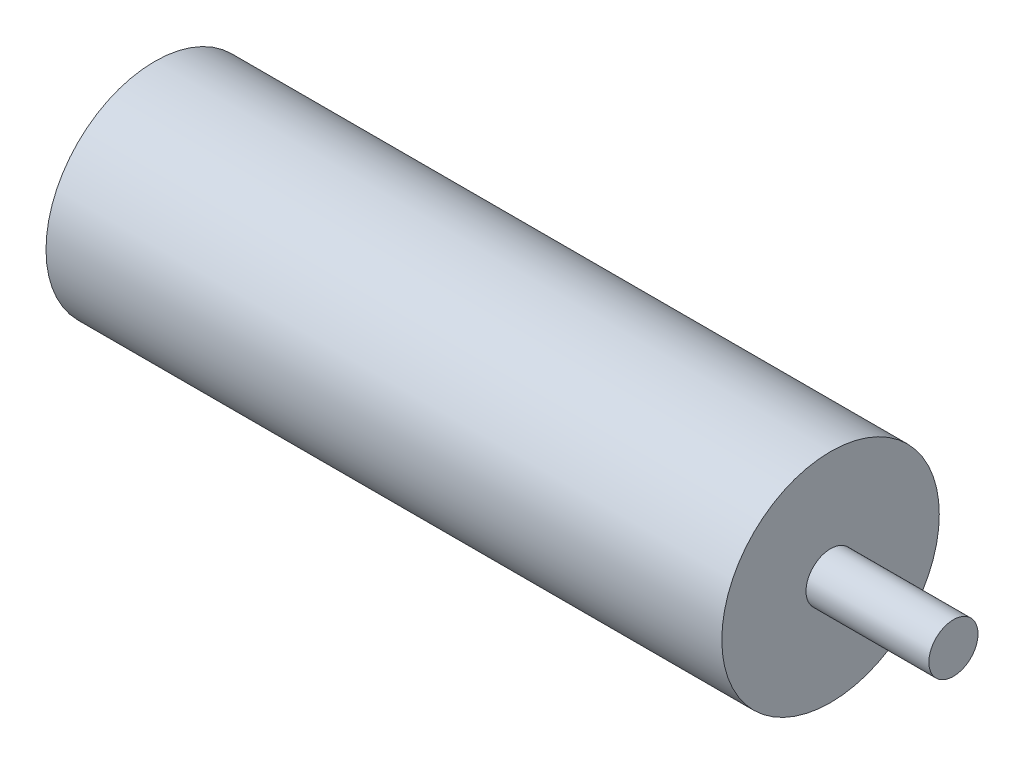
ISO-10303-21;
HEADER;
FILE_DESCRIPTION(('STEP AP214'),'2;1');
FILE_NAME('part.step','',(''),(''),'','','');
FILE_SCHEMA(('AUTOMOTIVE_DESIGN { 1 0 10303 214 1 1 1 1 }'));
ENDSEC;
DATA;
#1=APPLICATION_CONTEXT('core data for automotive mechanical design processes');
#2=APPLICATION_PROTOCOL_DEFINITION('international standard','automotive_design',2000,#1);
#3=PRODUCT_CONTEXT('',#1,'mechanical');
#4=PRODUCT('Part','Part','',(#3));
#5=PRODUCT_RELATED_PRODUCT_CATEGORY('part','',(#4));
#6=PRODUCT_DEFINITION_FORMATION('','',#4);
#7=PRODUCT_DEFINITION_CONTEXT('part definition',#1,'design');
#8=PRODUCT_DEFINITION('design','',#6,#7);
#9=PRODUCT_DEFINITION_SHAPE('','',#8);
#10=(LENGTH_UNIT() NAMED_UNIT(*) SI_UNIT(.MILLI.,.METRE.));
#11=(NAMED_UNIT(*) PLANE_ANGLE_UNIT() SI_UNIT($,.RADIAN.));
#12=(NAMED_UNIT(*) SI_UNIT($,.STERADIAN.) SOLID_ANGLE_UNIT());
#13=UNCERTAINTY_MEASURE_WITH_UNIT(LENGTH_MEASURE(1.E-05),#10,'distance_accuracy_value','');
#14=(GEOMETRIC_REPRESENTATION_CONTEXT(3) GLOBAL_UNCERTAINTY_ASSIGNED_CONTEXT((#13)) GLOBAL_UNIT_ASSIGNED_CONTEXT((#10,
#11,#12)) REPRESENTATION_CONTEXT('',''));
#15=CARTESIAN_POINT('',(0.,0.,0.));
#16=DIRECTION('',(0.,0.,1.));
#17=DIRECTION('',(1.,0.,0.));
#18=AXIS2_PLACEMENT_3D('',#15,#16,#17);
#19=CARTESIAN_POINT('',(139.7,0.,0.));
#20=DIRECTION('',(-1.,0.,0.));
#21=DIRECTION('',(0.,0.,1.));
#22=AXIS2_PLACEMENT_3D('',#19,#20,#21);
#23=CYLINDRICAL_SURFACE('',#22,22.479);
#24=CARTESIAN_POINT('',(139.7,0.,0.));
#25=DIRECTION('',(1.,0.,0.));
#26=DIRECTION('',(0.,0.,-1.));
#27=AXIS2_PLACEMENT_3D('',#24,#25,#26);
#28=CIRCLE('',#27,22.479);
#29=CARTESIAN_POINT('',(139.7,0.,-22.479));
#30=VERTEX_POINT('',#29);
#31=EDGE_CURVE('E10',#30,#30,#28,.T.);
#32=ORIENTED_EDGE('',*,*,#31,.F.);
#33=EDGE_LOOP('',(#32));
#34=FACE_BOUND('',#33,.T.);
#35=CARTESIAN_POINT('',(0.,0.,0.));
#36=DIRECTION('',(1.,0.,0.));
#37=DIRECTION('',(0.,0.,-1.));
#38=AXIS2_PLACEMENT_3D('',#35,#36,#37);
#39=CIRCLE('',#38,22.479);
#40=CARTESIAN_POINT('',(0.,0.,-22.479));
#41=VERTEX_POINT('',#40);
#42=EDGE_CURVE('E34',#41,#41,#39,.T.);
#43=ORIENTED_EDGE('',*,*,#42,.T.);
#44=EDGE_LOOP('',(#43));
#45=FACE_BOUND('',#44,.T.);
#46=ADVANCED_FACE('F31',(#34,#45),#23,.T.);
#47=CARTESIAN_POINT('',(139.7,0.,0.));
#48=DIRECTION('',(1.,0.,0.));
#49=DIRECTION('',(0.,0.,-1.));
#50=AXIS2_PLACEMENT_3D('',#47,#48,#49);
#51=PLANE('',#50);
#52=CARTESIAN_POINT('',(139.7,0.,0.));
#53=DIRECTION('',(1.,0.,0.));
#54=DIRECTION('',(0.,0.,-1.));
#55=AXIS2_PLACEMENT_3D('',#52,#53,#54);
#56=CIRCLE('',#55,5.08);
#57=CARTESIAN_POINT('',(139.7,0.,-5.08));
#58=VERTEX_POINT('',#57);
#59=EDGE_CURVE('E43',#58,#58,#56,.T.);
#60=ORIENTED_EDGE('',*,*,#59,.F.);
#61=EDGE_LOOP('',(#60));
#62=FACE_BOUND('',#61,.T.);
#63=ORIENTED_EDGE('',*,*,#31,.T.);
#64=EDGE_LOOP('',(#63));
#65=FACE_BOUND('',#64,.T.);
#66=ADVANCED_FACE('F58',(#62,#65),#51,.T.);
#67=CARTESIAN_POINT('',(0.,0.,0.));
#68=DIRECTION('',(1.,0.,0.));
#69=DIRECTION('',(0.,0.,-1.));
#70=AXIS2_PLACEMENT_3D('',#67,#68,#69);
#71=PLANE('',#70);
#72=ORIENTED_EDGE('',*,*,#42,.F.);
#73=EDGE_LOOP('',(#72));
#74=FACE_BOUND('',#73,.T.);
#75=ADVANCED_FACE('F54',(#74),#71,.F.);
#76=CARTESIAN_POINT('',(165.1,0.,0.));
#77=DIRECTION('',(-1.,0.,0.));
#78=DIRECTION('',(0.,0.,1.));
#79=AXIS2_PLACEMENT_3D('',#76,#77,#78);
#80=CYLINDRICAL_SURFACE('',#79,5.08);
#81=CARTESIAN_POINT('',(165.1,0.,0.));
#82=DIRECTION('',(1.,0.,0.));
#83=DIRECTION('',(0.,0.,-1.));
#84=AXIS2_PLACEMENT_3D('',#81,#82,#83);
#85=CIRCLE('',#84,5.08);
#86=CARTESIAN_POINT('',(165.1,0.,-5.08));
#87=VERTEX_POINT('',#86);
#88=EDGE_CURVE('E41',#87,#87,#85,.T.);
#89=ORIENTED_EDGE('',*,*,#88,.F.);
#90=EDGE_LOOP('',(#89));
#91=FACE_BOUND('',#90,.T.);
#92=ORIENTED_EDGE('',*,*,#59,.T.);
#93=EDGE_LOOP('',(#92));
#94=FACE_BOUND('',#93,.T.);
#95=ADVANCED_FACE('F51',(#91,#94),#80,.T.);
#96=CARTESIAN_POINT('',(165.1,0.,0.));
#97=DIRECTION('',(1.,0.,0.));
#98=DIRECTION('',(0.,0.,-1.));
#99=AXIS2_PLACEMENT_3D('',#96,#97,#98);
#100=PLANE('',#99);
#101=ORIENTED_EDGE('',*,*,#88,.T.);
#102=EDGE_LOOP('',(#101));
#103=FACE_BOUND('',#102,.T.);
#104=ADVANCED_FACE('F49',(#103),#100,.T.);
#105=CLOSED_SHELL('',(#46,#66,#75,#95,#104));
#106=MANIFOLD_SOLID_BREP('B2',#105);
#107=ADVANCED_BREP_SHAPE_REPRESENTATION('',(#18,#106),#14);
#108=SHAPE_DEFINITION_REPRESENTATION(#9,#107);
ENDSEC;
END-ISO-10303-21;
